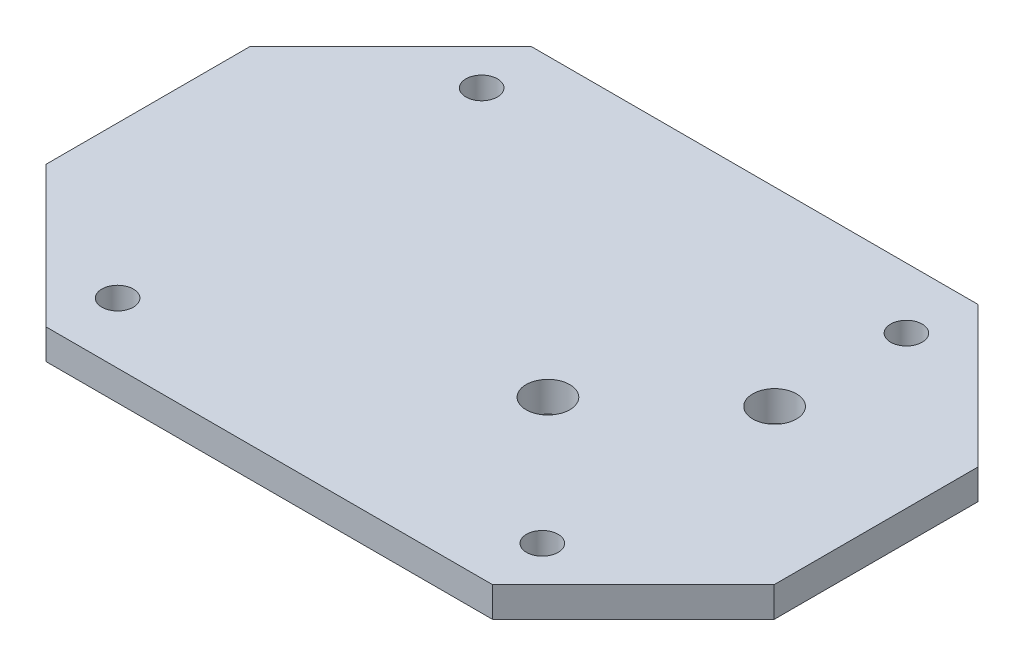
ISO-10303-21;
HEADER;
FILE_DESCRIPTION(('STEP AP214'),'2;1');
FILE_NAME('part.step','',(''),(''),'','','');
FILE_SCHEMA(('AUTOMOTIVE_DESIGN { 1 0 10303 214 1 1 1 1 }'));
ENDSEC;
DATA;
#1=APPLICATION_CONTEXT('core data for automotive mechanical design processes');
#2=APPLICATION_PROTOCOL_DEFINITION('international standard','automotive_design',2000,#1);
#3=PRODUCT_CONTEXT('',#1,'mechanical');
#4=PRODUCT('Part','Part','',(#3));
#5=PRODUCT_RELATED_PRODUCT_CATEGORY('part','',(#4));
#6=PRODUCT_DEFINITION_FORMATION('','',#4);
#7=PRODUCT_DEFINITION_CONTEXT('part definition',#1,'design');
#8=PRODUCT_DEFINITION('design','',#6,#7);
#9=PRODUCT_DEFINITION_SHAPE('','',#8);
#10=(LENGTH_UNIT() NAMED_UNIT(*) SI_UNIT(.MILLI.,.METRE.));
#11=(NAMED_UNIT(*) PLANE_ANGLE_UNIT() SI_UNIT($,.RADIAN.));
#12=(NAMED_UNIT(*) SI_UNIT($,.STERADIAN.) SOLID_ANGLE_UNIT());
#13=UNCERTAINTY_MEASURE_WITH_UNIT(LENGTH_MEASURE(1.E-05),#10,'distance_accuracy_value','');
#14=(GEOMETRIC_REPRESENTATION_CONTEXT(3) GLOBAL_UNCERTAINTY_ASSIGNED_CONTEXT((#13)) GLOBAL_UNIT_ASSIGNED_CONTEXT((#10,
#11,#12)) REPRESENTATION_CONTEXT('',''));
#15=CARTESIAN_POINT('',(0.,0.,0.));
#16=DIRECTION('',(0.,0.,1.));
#17=DIRECTION('',(1.,0.,0.));
#18=AXIS2_PLACEMENT_3D('',#15,#16,#17);
#19=CARTESIAN_POINT('',(0.,3.1496,0.));
#20=DIRECTION('',(0.,1.,0.));
#21=DIRECTION('',(0.,0.,1.));
#22=AXIS2_PLACEMENT_3D('',#19,#20,#21);
#23=PLANE('',#22);
#24=CARTESIAN_POINT('',(9.27099999999997,3.1496,5.5118));
#25=DIRECTION('',(0.,1.,0.));
#26=DIRECTION('',(0.,0.,1.));
#27=AXIS2_PLACEMENT_3D('',#24,#25,#26);
#28=CIRCLE('',#27,2.286);
#29=CARTESIAN_POINT('',(9.27099999999997,3.1496,7.7978));
#30=VERTEX_POINT('',#29);
#31=EDGE_CURVE('E200',#30,#30,#28,.T.);
#32=ORIENTED_EDGE('',*,*,#31,.F.);
#33=EDGE_LOOP('',(#32));
#34=FACE_BOUND('',#33,.T.);
#35=CARTESIAN_POINT('',(22.225,3.1496,19.05));
#36=DIRECTION('',(0.,1.,0.));
#37=DIRECTION('',(0.,0.,1.));
#38=AXIS2_PLACEMENT_3D('',#35,#36,#37);
#39=CIRCLE('',#38,1.651);
#40=CARTESIAN_POINT('',(22.225,3.1496,20.701));
#41=VERTEX_POINT('',#40);
#42=EDGE_CURVE('E188',#41,#41,#39,.T.);
#43=ORIENTED_EDGE('',*,*,#42,.F.);
#44=EDGE_LOOP('',(#43));
#45=FACE_BOUND('',#44,.T.);
#46=CARTESIAN_POINT('',(-22.225,3.1496,-19.05));
#47=DIRECTION('',(0.,1.,0.));
#48=DIRECTION('',(0.,0.,1.));
#49=AXIS2_PLACEMENT_3D('',#46,#47,#48);
#50=CIRCLE('',#49,1.651);
#51=CARTESIAN_POINT('',(-22.225,3.1496,-17.399));
#52=VERTEX_POINT('',#51);
#53=EDGE_CURVE('E134',#52,#52,#50,.T.);
#54=ORIENTED_EDGE('',*,*,#53,.F.);
#55=EDGE_LOOP('',(#54));
#56=FACE_BOUND('',#55,.T.);
#57=DIRECTION('',(-0.707106781186545,0.,-0.70710678118655));
#58=VECTOR('',#57,1.);
#59=CARTESIAN_POINT('',(23.3680000000001,3.1496,-25.4));
#60=LINE('',#59,#58);
#61=CARTESIAN_POINT('',(38.1,3.1496,-10.668));
#62=VERTEX_POINT('',#61);
#63=CARTESIAN_POINT('',(23.3680000000001,3.1496,-25.4));
#64=VERTEX_POINT('',#63);
#65=EDGE_CURVE('E145',#62,#64,#60,.T.);
#66=ORIENTED_EDGE('',*,*,#65,.T.);
#67=DIRECTION('',(-1.,0.,0.));
#68=VECTOR('',#67,1.);
#69=CARTESIAN_POINT('',(-23.3680000000001,3.1496,-25.4));
#70=LINE('',#69,#68);
#71=CARTESIAN_POINT('',(-23.3680000000001,3.1496,-25.4));
#72=VERTEX_POINT('',#71);
#73=EDGE_CURVE('E93',#64,#72,#70,.T.);
#74=ORIENTED_EDGE('',*,*,#73,.T.);
#75=DIRECTION('',(-0.707106781186546,0.,0.707106781186549));
#76=VECTOR('',#75,1.);
#77=CARTESIAN_POINT('',(-23.3680000000001,3.1496,-25.4));
#78=LINE('',#77,#76);
#79=CARTESIAN_POINT('',(-38.1,3.1496,-10.668));
#80=VERTEX_POINT('',#79);
#81=EDGE_CURVE('E160',#72,#80,#78,.T.);
#82=ORIENTED_EDGE('',*,*,#81,.T.);
#83=DIRECTION('',(0.,0.,1.));
#84=VECTOR('',#83,1.);
#85=CARTESIAN_POINT('',(-38.1,3.1496,-10.668));
#86=LINE('',#85,#84);
#87=CARTESIAN_POINT('',(-38.1,3.1496,10.668));
#88=VERTEX_POINT('',#87);
#89=EDGE_CURVE('E173',#80,#88,#86,.T.);
#90=ORIENTED_EDGE('',*,*,#89,.T.);
#91=DIRECTION('',(0.707106781186546,0.,0.707106781186549));
#92=VECTOR('',#91,1.);
#93=CARTESIAN_POINT('',(-23.3680000000001,3.1496,25.4));
#94=LINE('',#93,#92);
#95=CARTESIAN_POINT('',(-23.3680000000001,3.1496,25.4));
#96=VERTEX_POINT('',#95);
#97=EDGE_CURVE('E112',#88,#96,#94,.T.);
#98=ORIENTED_EDGE('',*,*,#97,.T.);
#99=DIRECTION('',(1.,0.,0.));
#100=VECTOR('',#99,1.);
#101=CARTESIAN_POINT('',(-23.3680000000001,3.1496,25.4));
#102=LINE('',#101,#100);
#103=CARTESIAN_POINT('',(23.3680000000001,3.1496,25.4));
#104=VERTEX_POINT('',#103);
#105=EDGE_CURVE('E106',#96,#104,#102,.T.);
#106=ORIENTED_EDGE('',*,*,#105,.T.);
#107=DIRECTION('',(0.707106781186545,0.,-0.70710678118655));
#108=VECTOR('',#107,1.);
#109=CARTESIAN_POINT('',(23.3680000000001,3.1496,25.4));
#110=LINE('',#109,#108);
#111=CARTESIAN_POINT('',(38.1,3.1496,10.668));
#112=VERTEX_POINT('',#111);
#113=EDGE_CURVE('E110',#104,#112,#110,.T.);
#114=ORIENTED_EDGE('',*,*,#113,.T.);
#115=DIRECTION('',(0.,0.,-1.));
#116=VECTOR('',#115,1.);
#117=CARTESIAN_POINT('',(38.1,3.1496,-10.668));
#118=LINE('',#117,#116);
#119=EDGE_CURVE('E50',#112,#62,#118,.T.);
#120=ORIENTED_EDGE('',*,*,#119,.T.);
#121=EDGE_LOOP('',(#66,#74,#82,#90,#98,#106,#114,#120));
#122=FACE_BOUND('',#121,.T.);
#123=CARTESIAN_POINT('',(22.225,3.1496,-19.05));
#124=DIRECTION('',(0.,1.,0.));
#125=DIRECTION('',(0.,0.,1.));
#126=AXIS2_PLACEMENT_3D('',#123,#124,#125);
#127=CIRCLE('',#126,1.651);
#128=CARTESIAN_POINT('',(22.225,3.1496,-17.399));
#129=VERTEX_POINT('',#128);
#130=EDGE_CURVE('E182',#129,#129,#127,.T.);
#131=ORIENTED_EDGE('',*,*,#130,.F.);
#132=EDGE_LOOP('',(#131));
#133=FACE_BOUND('',#132,.T.);
#134=CARTESIAN_POINT('',(-22.225,3.1496,19.05));
#135=DIRECTION('',(0.,1.,0.));
#136=DIRECTION('',(0.,0.,1.));
#137=AXIS2_PLACEMENT_3D('',#134,#135,#136);
#138=CIRCLE('',#137,1.651);
#139=CARTESIAN_POINT('',(-22.225,3.1496,20.701));
#140=VERTEX_POINT('',#139);
#141=EDGE_CURVE('E194',#140,#140,#138,.T.);
#142=ORIENTED_EDGE('',*,*,#141,.F.);
#143=EDGE_LOOP('',(#142));
#144=FACE_BOUND('',#143,.T.);
#145=CARTESIAN_POINT('',(21.971,3.1496,-5.5118));
#146=DIRECTION('',(0.,1.,0.));
#147=DIRECTION('',(0.,0.,1.));
#148=AXIS2_PLACEMENT_3D('',#145,#146,#147);
#149=CIRCLE('',#148,2.286);
#150=CARTESIAN_POINT('',(21.971,3.1496,-3.2258));
#151=VERTEX_POINT('',#150);
#152=EDGE_CURVE('E206',#151,#151,#149,.T.);
#153=ORIENTED_EDGE('',*,*,#152,.F.);
#154=EDGE_LOOP('',(#153));
#155=FACE_BOUND('',#154,.T.);
#156=ADVANCED_FACE('F33',(#34,#45,#56,#122,#133,#144,#155),#23,.T.);
#157=CARTESIAN_POINT('',(0.,0.,0.));
#158=DIRECTION('',(0.,1.,0.));
#159=DIRECTION('',(0.,0.,1.));
#160=AXIS2_PLACEMENT_3D('',#157,#158,#159);
#161=PLANE('',#160);
#162=CARTESIAN_POINT('',(9.27099999999997,0.,5.5118));
#163=DIRECTION('',(0.,1.,0.));
#164=DIRECTION('',(0.,0.,1.));
#165=AXIS2_PLACEMENT_3D('',#162,#163,#164);
#166=CIRCLE('',#165,2.286);
#167=CARTESIAN_POINT('',(9.27099999999997,0.,7.7978));
#168=VERTEX_POINT('',#167);
#169=EDGE_CURVE('E203',#168,#168,#166,.T.);
#170=ORIENTED_EDGE('',*,*,#169,.T.);
#171=EDGE_LOOP('',(#170));
#172=FACE_BOUND('',#171,.T.);
#173=CARTESIAN_POINT('',(22.225,0.,19.05));
#174=DIRECTION('',(0.,1.,0.));
#175=DIRECTION('',(0.,0.,1.));
#176=AXIS2_PLACEMENT_3D('',#173,#174,#175);
#177=CIRCLE('',#176,1.651);
#178=CARTESIAN_POINT('',(22.225,0.,20.701));
#179=VERTEX_POINT('',#178);
#180=EDGE_CURVE('E191',#179,#179,#177,.T.);
#181=ORIENTED_EDGE('',*,*,#180,.T.);
#182=EDGE_LOOP('',(#181));
#183=FACE_BOUND('',#182,.T.);
#184=CARTESIAN_POINT('',(-22.225,0.,-19.05));
#185=DIRECTION('',(0.,1.,0.));
#186=DIRECTION('',(0.,0.,1.));
#187=AXIS2_PLACEMENT_3D('',#184,#185,#186);
#188=CIRCLE('',#187,1.651);
#189=CARTESIAN_POINT('',(-22.225,0.,-17.399));
#190=VERTEX_POINT('',#189);
#191=EDGE_CURVE('E179',#190,#190,#188,.T.);
#192=ORIENTED_EDGE('',*,*,#191,.T.);
#193=EDGE_LOOP('',(#192));
#194=FACE_BOUND('',#193,.T.);
#195=DIRECTION('',(-0.707106781186545,0.,-0.70710678118655));
#196=VECTOR('',#195,1.);
#197=CARTESIAN_POINT('',(23.3680000000001,0.,-25.4));
#198=LINE('',#197,#196);
#199=CARTESIAN_POINT('',(38.1,0.,-10.668));
#200=VERTEX_POINT('',#199);
#201=CARTESIAN_POINT('',(23.3680000000001,0.,-25.4));
#202=VERTEX_POINT('',#201);
#203=EDGE_CURVE('E130',#200,#202,#198,.T.);
#204=ORIENTED_EDGE('',*,*,#203,.F.);
#205=DIRECTION('',(0.,0.,-1.));
#206=VECTOR('',#205,1.);
#207=CARTESIAN_POINT('',(38.1,0.,-10.668));
#208=LINE('',#207,#206);
#209=CARTESIAN_POINT('',(38.1,0.,10.668));
#210=VERTEX_POINT('',#209);
#211=EDGE_CURVE('E85',#210,#200,#208,.T.);
#212=ORIENTED_EDGE('',*,*,#211,.F.);
#213=DIRECTION('',(0.707106781186545,0.,-0.70710678118655));
#214=VECTOR('',#213,1.);
#215=CARTESIAN_POINT('',(23.3680000000001,0.,25.4));
#216=LINE('',#215,#214);
#217=CARTESIAN_POINT('',(23.3680000000001,0.,25.4));
#218=VERTEX_POINT('',#217);
#219=EDGE_CURVE('E79',#218,#210,#216,.T.);
#220=ORIENTED_EDGE('',*,*,#219,.F.);
#221=DIRECTION('',(1.,0.,0.));
#222=VECTOR('',#221,1.);
#223=CARTESIAN_POINT('',(-23.3680000000001,0.,25.4));
#224=LINE('',#223,#222);
#225=CARTESIAN_POINT('',(-23.3680000000001,0.,25.4));
#226=VERTEX_POINT('',#225);
#227=EDGE_CURVE('E120',#226,#218,#224,.T.);
#228=ORIENTED_EDGE('',*,*,#227,.F.);
#229=DIRECTION('',(0.707106781186546,0.,0.707106781186549));
#230=VECTOR('',#229,1.);
#231=CARTESIAN_POINT('',(-23.3680000000001,0.,25.4));
#232=LINE('',#231,#230);
#233=CARTESIAN_POINT('',(-38.1,0.,10.668));
#234=VERTEX_POINT('',#233);
#235=EDGE_CURVE('E140',#234,#226,#232,.T.);
#236=ORIENTED_EDGE('',*,*,#235,.F.);
#237=DIRECTION('',(0.,0.,1.));
#238=VECTOR('',#237,1.);
#239=CARTESIAN_POINT('',(-38.1,0.,-10.668));
#240=LINE('',#239,#238);
#241=CARTESIAN_POINT('',(-38.1,0.,-10.668));
#242=VERTEX_POINT('',#241);
#243=EDGE_CURVE('E138',#242,#234,#240,.T.);
#244=ORIENTED_EDGE('',*,*,#243,.F.);
#245=DIRECTION('',(-0.707106781186546,0.,0.707106781186549));
#246=VECTOR('',#245,1.);
#247=CARTESIAN_POINT('',(-23.3680000000001,0.,-25.4));
#248=LINE('',#247,#246);
#249=CARTESIAN_POINT('',(-23.3680000000001,0.,-25.4));
#250=VERTEX_POINT('',#249);
#251=EDGE_CURVE('E136',#250,#242,#248,.T.);
#252=ORIENTED_EDGE('',*,*,#251,.F.);
#253=DIRECTION('',(-1.,0.,0.));
#254=VECTOR('',#253,1.);
#255=CARTESIAN_POINT('',(-23.3680000000001,0.,-25.4));
#256=LINE('',#255,#254);
#257=EDGE_CURVE('E133',#202,#250,#256,.T.);
#258=ORIENTED_EDGE('',*,*,#257,.F.);
#259=EDGE_LOOP('',(#204,#212,#220,#228,#236,#244,#252,#258));
#260=FACE_BOUND('',#259,.T.);
#261=CARTESIAN_POINT('',(22.225,0.,-19.05));
#262=DIRECTION('',(0.,1.,0.));
#263=DIRECTION('',(0.,0.,1.));
#264=AXIS2_PLACEMENT_3D('',#261,#262,#263);
#265=CIRCLE('',#264,1.651);
#266=CARTESIAN_POINT('',(22.225,0.,-17.399));
#267=VERTEX_POINT('',#266);
#268=EDGE_CURVE('E185',#267,#267,#265,.T.);
#269=ORIENTED_EDGE('',*,*,#268,.T.);
#270=EDGE_LOOP('',(#269));
#271=FACE_BOUND('',#270,.T.);
#272=CARTESIAN_POINT('',(-22.225,0.,19.05));
#273=DIRECTION('',(0.,1.,0.));
#274=DIRECTION('',(0.,0.,1.));
#275=AXIS2_PLACEMENT_3D('',#272,#273,#274);
#276=CIRCLE('',#275,1.651);
#277=CARTESIAN_POINT('',(-22.225,0.,20.701));
#278=VERTEX_POINT('',#277);
#279=EDGE_CURVE('E197',#278,#278,#276,.T.);
#280=ORIENTED_EDGE('',*,*,#279,.T.);
#281=EDGE_LOOP('',(#280));
#282=FACE_BOUND('',#281,.T.);
#283=CARTESIAN_POINT('',(21.971,0.,-5.5118));
#284=DIRECTION('',(0.,1.,0.));
#285=DIRECTION('',(0.,0.,1.));
#286=AXIS2_PLACEMENT_3D('',#283,#284,#285);
#287=CIRCLE('',#286,2.286);
#288=CARTESIAN_POINT('',(21.971,0.,-3.2258));
#289=VERTEX_POINT('',#288);
#290=EDGE_CURVE('E209',#289,#289,#287,.T.);
#291=ORIENTED_EDGE('',*,*,#290,.T.);
#292=EDGE_LOOP('',(#291));
#293=FACE_BOUND('',#292,.T.);
#294=ADVANCED_FACE('F164',(#172,#183,#194,#260,#271,#282,#293),#161,.F.);
#295=CARTESIAN_POINT('',(23.3680000000001,3.1496,-25.4));
#296=DIRECTION('',(-0.70710678118655,0.,0.707106781186545));
#297=DIRECTION('',(0.707106781186545,0.,0.70710678118655));
#298=AXIS2_PLACEMENT_3D('',#295,#296,#297);
#299=PLANE('',#298);
#300=ORIENTED_EDGE('',*,*,#203,.T.);
#301=DIRECTION('',(0.,-1.,0.));
#302=VECTOR('',#301,1.);
#303=CARTESIAN_POINT('',(23.3680000000001,3.1496,-25.4));
#304=LINE('',#303,#302);
#305=EDGE_CURVE('E11',#64,#202,#304,.T.);
#306=ORIENTED_EDGE('',*,*,#305,.F.);
#307=ORIENTED_EDGE('',*,*,#65,.F.);
#308=DIRECTION('',(0.,-1.,0.));
#309=VECTOR('',#308,1.);
#310=CARTESIAN_POINT('',(38.1,3.1496,-10.668));
#311=LINE('',#310,#309);
#312=EDGE_CURVE('E126',#62,#200,#311,.T.);
#313=ORIENTED_EDGE('',*,*,#312,.T.);
#314=EDGE_LOOP('',(#300,#306,#307,#313));
#315=FACE_BOUND('',#314,.T.);
#316=ADVANCED_FACE('F35',(#315),#299,.F.);
#317=CARTESIAN_POINT('',(-23.3680000000001,3.1496,-25.4));
#318=DIRECTION('',(0.,0.,1.));
#319=DIRECTION('',(1.,0.,0.));
#320=AXIS2_PLACEMENT_3D('',#317,#318,#319);
#321=PLANE('',#320);
#322=ORIENTED_EDGE('',*,*,#257,.T.);
#323=DIRECTION('',(0.,-1.,0.));
#324=VECTOR('',#323,1.);
#325=CARTESIAN_POINT('',(-23.3680000000001,3.1496,-25.4));
#326=LINE('',#325,#324);
#327=EDGE_CURVE('E42',#72,#250,#326,.T.);
#328=ORIENTED_EDGE('',*,*,#327,.F.);
#329=ORIENTED_EDGE('',*,*,#73,.F.);
#330=ORIENTED_EDGE('',*,*,#305,.T.);
#331=EDGE_LOOP('',(#322,#328,#329,#330));
#332=FACE_BOUND('',#331,.T.);
#333=ADVANCED_FACE('F244',(#332),#321,.F.);
#334=CARTESIAN_POINT('',(-23.3680000000001,3.1496,-25.4));
#335=DIRECTION('',(0.707106781186549,0.,0.707106781186546));
#336=DIRECTION('',(0.707106781186546,0.,-0.707106781186549));
#337=AXIS2_PLACEMENT_3D('',#334,#335,#336);
#338=PLANE('',#337);
#339=ORIENTED_EDGE('',*,*,#251,.T.);
#340=DIRECTION('',(0.,-1.,0.));
#341=VECTOR('',#340,1.);
#342=CARTESIAN_POINT('',(-38.1,3.1496,-10.668));
#343=LINE('',#342,#341);
#344=EDGE_CURVE('E152',#80,#242,#343,.T.);
#345=ORIENTED_EDGE('',*,*,#344,.F.);
#346=ORIENTED_EDGE('',*,*,#81,.F.);
#347=ORIENTED_EDGE('',*,*,#327,.T.);
#348=EDGE_LOOP('',(#339,#345,#346,#347));
#349=FACE_BOUND('',#348,.T.);
#350=ADVANCED_FACE('F158',(#349),#338,.F.);
#351=CARTESIAN_POINT('',(-38.1,3.1496,-10.668));
#352=DIRECTION('',(1.,0.,0.));
#353=DIRECTION('',(0.,0.,-1.));
#354=AXIS2_PLACEMENT_3D('',#351,#352,#353);
#355=PLANE('',#354);
#356=ORIENTED_EDGE('',*,*,#243,.T.);
#357=DIRECTION('',(0.,-1.,0.));
#358=VECTOR('',#357,1.);
#359=CARTESIAN_POINT('',(-38.1,3.1496,10.668));
#360=LINE('',#359,#358);
#361=EDGE_CURVE('E149',#88,#234,#360,.T.);
#362=ORIENTED_EDGE('',*,*,#361,.F.);
#363=ORIENTED_EDGE('',*,*,#89,.F.);
#364=ORIENTED_EDGE('',*,*,#344,.T.);
#365=EDGE_LOOP('',(#356,#362,#363,#364));
#366=FACE_BOUND('',#365,.T.);
#367=ADVANCED_FACE('F169',(#366),#355,.F.);
#368=CARTESIAN_POINT('',(-23.3680000000001,3.1496,25.4));
#369=DIRECTION('',(0.707106781186549,0.,-0.707106781186546));
#370=DIRECTION('',(-0.707106781186546,0.,-0.707106781186549));
#371=AXIS2_PLACEMENT_3D('',#368,#369,#370);
#372=PLANE('',#371);
#373=ORIENTED_EDGE('',*,*,#235,.T.);
#374=DIRECTION('',(0.,-1.,0.));
#375=VECTOR('',#374,1.);
#376=CARTESIAN_POINT('',(-23.3680000000001,3.1496,25.4));
#377=LINE('',#376,#375);
#378=EDGE_CURVE('E121',#96,#226,#377,.T.);
#379=ORIENTED_EDGE('',*,*,#378,.F.);
#380=ORIENTED_EDGE('',*,*,#97,.F.);
#381=ORIENTED_EDGE('',*,*,#361,.T.);
#382=EDGE_LOOP('',(#373,#379,#380,#381));
#383=FACE_BOUND('',#382,.T.);
#384=ADVANCED_FACE('F172',(#383),#372,.F.);
#385=CARTESIAN_POINT('',(-23.3680000000001,3.1496,25.4));
#386=DIRECTION('',(0.,0.,-1.));
#387=DIRECTION('',(-1.,0.,0.));
#388=AXIS2_PLACEMENT_3D('',#385,#386,#387);
#389=PLANE('',#388);
#390=ORIENTED_EDGE('',*,*,#227,.T.);
#391=DIRECTION('',(0.,-1.,0.));
#392=VECTOR('',#391,1.);
#393=CARTESIAN_POINT('',(23.3680000000001,3.1496,25.4));
#394=LINE('',#393,#392);
#395=EDGE_CURVE('E117',#104,#218,#394,.T.);
#396=ORIENTED_EDGE('',*,*,#395,.F.);
#397=ORIENTED_EDGE('',*,*,#105,.F.);
#398=ORIENTED_EDGE('',*,*,#378,.T.);
#399=EDGE_LOOP('',(#390,#396,#397,#398));
#400=FACE_BOUND('',#399,.T.);
#401=ADVANCED_FACE('F118',(#400),#389,.F.);
#402=CARTESIAN_POINT('',(23.3680000000001,3.1496,25.4));
#403=DIRECTION('',(-0.70710678118655,0.,-0.707106781186545));
#404=DIRECTION('',(-0.707106781186545,0.,0.70710678118655));
#405=AXIS2_PLACEMENT_3D('',#402,#403,#404);
#406=PLANE('',#405);
#407=ORIENTED_EDGE('',*,*,#219,.T.);
#408=DIRECTION('',(0.,-1.,0.));
#409=VECTOR('',#408,1.);
#410=CARTESIAN_POINT('',(38.1,3.1496,10.668));
#411=LINE('',#410,#409);
#412=EDGE_CURVE('E122',#112,#210,#411,.T.);
#413=ORIENTED_EDGE('',*,*,#412,.F.);
#414=ORIENTED_EDGE('',*,*,#113,.F.);
#415=ORIENTED_EDGE('',*,*,#395,.T.);
#416=EDGE_LOOP('',(#407,#413,#414,#415));
#417=FACE_BOUND('',#416,.T.);
#418=ADVANCED_FACE('F124',(#417),#406,.F.);
#419=CARTESIAN_POINT('',(38.1,3.1496,-10.668));
#420=DIRECTION('',(-1.,0.,0.));
#421=DIRECTION('',(0.,0.,1.));
#422=AXIS2_PLACEMENT_3D('',#419,#420,#421);
#423=PLANE('',#422);
#424=ORIENTED_EDGE('',*,*,#211,.T.);
#425=ORIENTED_EDGE('',*,*,#312,.F.);
#426=ORIENTED_EDGE('',*,*,#119,.F.);
#427=ORIENTED_EDGE('',*,*,#412,.T.);
#428=EDGE_LOOP('',(#424,#425,#426,#427));
#429=FACE_BOUND('',#428,.T.);
#430=ADVANCED_FACE('F232',(#429),#423,.F.);
#431=CARTESIAN_POINT('',(-22.225,3.1496,-19.05));
#432=DIRECTION('',(0.,-1.,0.));
#433=DIRECTION('',(0.,0.,-1.));
#434=AXIS2_PLACEMENT_3D('',#431,#432,#433);
#435=CYLINDRICAL_SURFACE('',#434,1.651);
#436=ORIENTED_EDGE('',*,*,#53,.T.);
#437=EDGE_LOOP('',(#436));
#438=FACE_BOUND('',#437,.T.);
#439=ORIENTED_EDGE('',*,*,#191,.F.);
#440=EDGE_LOOP('',(#439));
#441=FACE_BOUND('',#440,.T.);
#442=ADVANCED_FACE('F229',(#438,#441),#435,.F.);
#443=CARTESIAN_POINT('',(22.225,3.1496,-19.05));
#444=DIRECTION('',(0.,-1.,0.));
#445=DIRECTION('',(0.,0.,-1.));
#446=AXIS2_PLACEMENT_3D('',#443,#444,#445);
#447=CYLINDRICAL_SURFACE('',#446,1.651);
#448=ORIENTED_EDGE('',*,*,#130,.T.);
#449=EDGE_LOOP('',(#448));
#450=FACE_BOUND('',#449,.T.);
#451=ORIENTED_EDGE('',*,*,#268,.F.);
#452=EDGE_LOOP('',(#451));
#453=FACE_BOUND('',#452,.T.);
#454=ADVANCED_FACE('F308',(#450,#453),#447,.F.);
#455=CARTESIAN_POINT('',(22.225,3.1496,19.05));
#456=DIRECTION('',(0.,-1.,0.));
#457=DIRECTION('',(0.,0.,-1.));
#458=AXIS2_PLACEMENT_3D('',#455,#456,#457);
#459=CYLINDRICAL_SURFACE('',#458,1.651);
#460=ORIENTED_EDGE('',*,*,#42,.T.);
#461=EDGE_LOOP('',(#460));
#462=FACE_BOUND('',#461,.T.);
#463=ORIENTED_EDGE('',*,*,#180,.F.);
#464=EDGE_LOOP('',(#463));
#465=FACE_BOUND('',#464,.T.);
#466=ADVANCED_FACE('F316',(#462,#465),#459,.F.);
#467=CARTESIAN_POINT('',(-22.225,3.1496,19.05));
#468=DIRECTION('',(0.,-1.,0.));
#469=DIRECTION('',(0.,0.,-1.));
#470=AXIS2_PLACEMENT_3D('',#467,#468,#469);
#471=CYLINDRICAL_SURFACE('',#470,1.651);
#472=ORIENTED_EDGE('',*,*,#141,.T.);
#473=EDGE_LOOP('',(#472));
#474=FACE_BOUND('',#473,.T.);
#475=ORIENTED_EDGE('',*,*,#279,.F.);
#476=EDGE_LOOP('',(#475));
#477=FACE_BOUND('',#476,.T.);
#478=ADVANCED_FACE('F324',(#474,#477),#471,.F.);
#479=CARTESIAN_POINT('',(9.27099999999997,3.1496,5.5118));
#480=DIRECTION('',(0.,-1.,0.));
#481=DIRECTION('',(0.,0.,-1.));
#482=AXIS2_PLACEMENT_3D('',#479,#480,#481);
#483=CYLINDRICAL_SURFACE('',#482,2.286);
#484=ORIENTED_EDGE('',*,*,#31,.T.);
#485=EDGE_LOOP('',(#484));
#486=FACE_BOUND('',#485,.T.);
#487=ORIENTED_EDGE('',*,*,#169,.F.);
#488=EDGE_LOOP('',(#487));
#489=FACE_BOUND('',#488,.T.);
#490=ADVANCED_FACE('F333',(#486,#489),#483,.F.);
#491=CARTESIAN_POINT('',(21.971,3.1496,-5.5118));
#492=DIRECTION('',(0.,-1.,0.));
#493=DIRECTION('',(0.,0.,-1.));
#494=AXIS2_PLACEMENT_3D('',#491,#492,#493);
#495=CYLINDRICAL_SURFACE('',#494,2.286);
#496=ORIENTED_EDGE('',*,*,#152,.T.);
#497=EDGE_LOOP('',(#496));
#498=FACE_BOUND('',#497,.T.);
#499=ORIENTED_EDGE('',*,*,#290,.F.);
#500=EDGE_LOOP('',(#499));
#501=FACE_BOUND('',#500,.T.);
#502=ADVANCED_FACE('F215',(#498,#501),#495,.F.);
#503=CLOSED_SHELL('',(#156,#294,#316,#333,#350,#367,#384,#401,#418,#430,#442,#454,#466,#478,
#490,#502));
#504=MANIFOLD_SOLID_BREP('B2',#503);
#505=ADVANCED_BREP_SHAPE_REPRESENTATION('',(#18,#504),#14);
#506=SHAPE_DEFINITION_REPRESENTATION(#9,#505);
ENDSEC;
END-ISO-10303-21;
